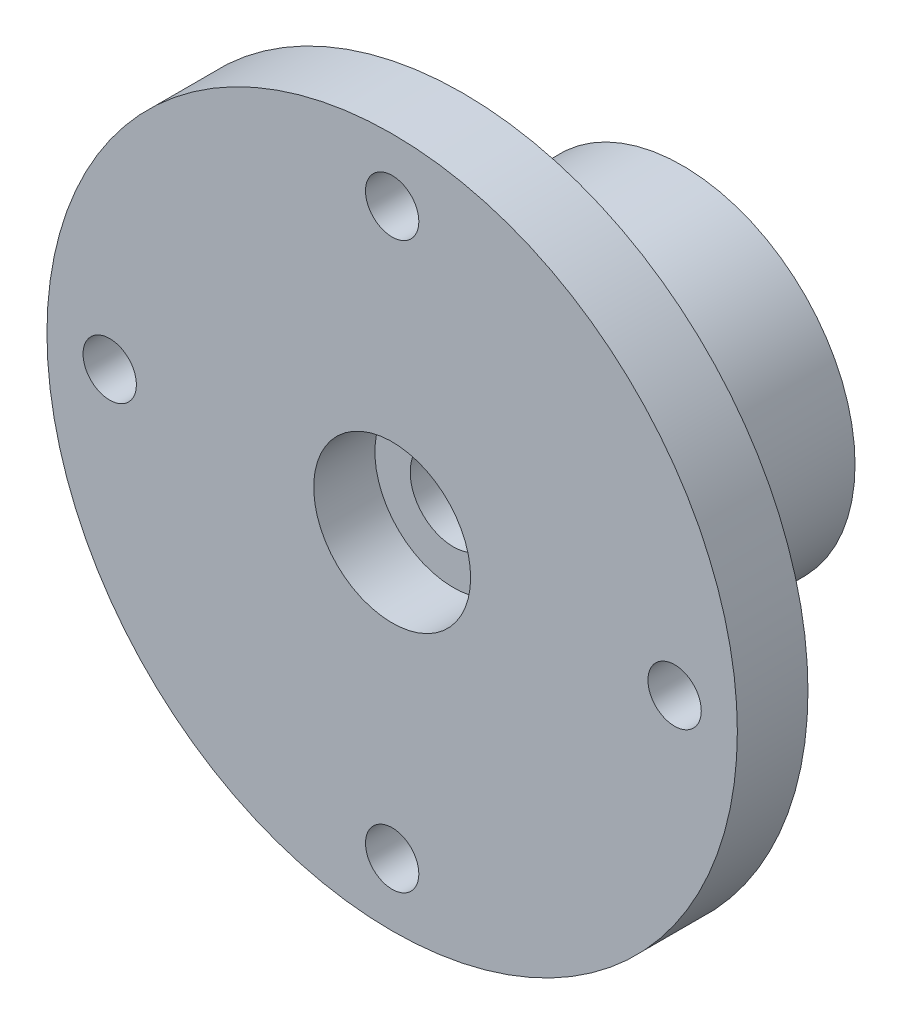
ISO-10303-21;
HEADER;
FILE_DESCRIPTION(('STEP AP214'),'2;1');
FILE_NAME('part.step','',(''),(''),'','','');
FILE_SCHEMA(('AUTOMOTIVE_DESIGN { 1 0 10303 214 1 1 1 1 }'));
ENDSEC;
DATA;
#1=APPLICATION_CONTEXT('core data for automotive mechanical design processes');
#2=APPLICATION_PROTOCOL_DEFINITION('international standard','automotive_design',2000,#1);
#3=PRODUCT_CONTEXT('',#1,'mechanical');
#4=PRODUCT('Part','Part','',(#3));
#5=PRODUCT_RELATED_PRODUCT_CATEGORY('part','',(#4));
#6=PRODUCT_DEFINITION_FORMATION('','',#4);
#7=PRODUCT_DEFINITION_CONTEXT('part definition',#1,'design');
#8=PRODUCT_DEFINITION('design','',#6,#7);
#9=PRODUCT_DEFINITION_SHAPE('','',#8);
#10=(LENGTH_UNIT() NAMED_UNIT(*) SI_UNIT(.MILLI.,.METRE.));
#11=(NAMED_UNIT(*) PLANE_ANGLE_UNIT() SI_UNIT($,.RADIAN.));
#12=(NAMED_UNIT(*) SI_UNIT($,.STERADIAN.) SOLID_ANGLE_UNIT());
#13=UNCERTAINTY_MEASURE_WITH_UNIT(LENGTH_MEASURE(1.E-05),#10,'distance_accuracy_value','');
#14=(GEOMETRIC_REPRESENTATION_CONTEXT(3) GLOBAL_UNCERTAINTY_ASSIGNED_CONTEXT((#13)) GLOBAL_UNIT_ASSIGNED_CONTEXT((#10,
#11,#12)) REPRESENTATION_CONTEXT('',''));
#15=CARTESIAN_POINT('',(0.,0.,0.));
#16=DIRECTION('',(0.,0.,1.));
#17=DIRECTION('',(1.,0.,0.));
#18=AXIS2_PLACEMENT_3D('',#15,#16,#17);
#19=CARTESIAN_POINT('',(0.,0.,14.));
#20=DIRECTION('',(0.,0.,-1.));
#21=DIRECTION('',(-1.,0.,0.));
#22=AXIS2_PLACEMENT_3D('',#19,#20,#21);
#23=CYLINDRICAL_SURFACE('',#22,11.);
#24=CARTESIAN_POINT('',(0.,0.,13.5));
#25=DIRECTION('',(0.,0.,1.));
#26=DIRECTION('',(1.,0.,0.));
#27=AXIS2_PLACEMENT_3D('',#24,#25,#26);
#28=CIRCLE('',#27,11.);
#29=CARTESIAN_POINT('',(11.,0.,13.5));
#30=VERTEX_POINT('',#29);
#31=EDGE_CURVE('E10',#30,#30,#28,.F.);
#32=ORIENTED_EDGE('',*,*,#31,.T.);
#33=EDGE_LOOP('',(#32));
#34=FACE_BOUND('',#33,.T.);
#35=CARTESIAN_POINT('',(0.,0.,0.));
#36=DIRECTION('',(0.,0.,1.));
#37=DIRECTION('',(1.,0.,0.));
#38=AXIS2_PLACEMENT_3D('',#35,#36,#37);
#39=CIRCLE('',#38,11.);
#40=CARTESIAN_POINT('',(11.,0.,0.));
#41=VERTEX_POINT('',#40);
#42=EDGE_CURVE('E56',#41,#41,#39,.T.);
#43=ORIENTED_EDGE('',*,*,#42,.T.);
#44=EDGE_LOOP('',(#43));
#45=FACE_BOUND('',#44,.T.);
#46=ADVANCED_FACE('F43',(#34,#45),#23,.T.);
#47=CARTESIAN_POINT('',(0.,0.,0.));
#48=DIRECTION('',(0.,0.,1.));
#49=DIRECTION('',(1.,0.,0.));
#50=AXIS2_PLACEMENT_3D('',#47,#48,#49);
#51=PLANE('',#50);
#52=CARTESIAN_POINT('',(0.,0.,0.));
#53=DIRECTION('',(0.,0.,1.));
#54=DIRECTION('',(1.,0.,0.));
#55=AXIS2_PLACEMENT_3D('',#52,#53,#54);
#56=CIRCLE('',#55,2.75);
#57=CARTESIAN_POINT('',(2.75,0.,0.));
#58=VERTEX_POINT('',#57);
#59=EDGE_CURVE('E103',#58,#58,#56,.T.);
#60=ORIENTED_EDGE('',*,*,#59,.T.);
#61=EDGE_LOOP('',(#60));
#62=FACE_BOUND('',#61,.T.);
#63=ORIENTED_EDGE('',*,*,#42,.F.);
#64=EDGE_LOOP('',(#63));
#65=FACE_BOUND('',#64,.T.);
#66=ADVANCED_FACE('F140',(#62,#65),#51,.F.);
#67=CARTESIAN_POINT('',(0.,0.,18.5));
#68=DIRECTION('',(0.,0.,-1.));
#69=DIRECTION('',(-1.,0.,0.));
#70=AXIS2_PLACEMENT_3D('',#67,#68,#69);
#71=CYLINDRICAL_SURFACE('',#70,22.);
#72=CARTESIAN_POINT('',(0.,0.,18.5));
#73=DIRECTION('',(0.,0.,1.));
#74=DIRECTION('',(1.,0.,0.));
#75=AXIS2_PLACEMENT_3D('',#72,#73,#74);
#76=CIRCLE('',#75,22.);
#77=CARTESIAN_POINT('',(22.,0.,18.5));
#78=VERTEX_POINT('',#77);
#79=EDGE_CURVE('E61',#78,#78,#76,.T.);
#80=ORIENTED_EDGE('',*,*,#79,.F.);
#81=EDGE_LOOP('',(#80));
#82=FACE_BOUND('',#81,.T.);
#83=CARTESIAN_POINT('',(0.,0.,14.));
#84=DIRECTION('',(0.,0.,1.));
#85=DIRECTION('',(1.,0.,0.));
#86=AXIS2_PLACEMENT_3D('',#83,#84,#85);
#87=CIRCLE('',#86,22.);
#88=CARTESIAN_POINT('',(22.,0.,14.));
#89=VERTEX_POINT('',#88);
#90=EDGE_CURVE('E80',#89,#89,#87,.T.);
#91=ORIENTED_EDGE('',*,*,#90,.T.);
#92=EDGE_LOOP('',(#91));
#93=FACE_BOUND('',#92,.T.);
#94=ADVANCED_FACE('F126',(#82,#93),#71,.T.);
#95=CARTESIAN_POINT('',(0.,0.,18.5));
#96=DIRECTION('',(0.,0.,1.));
#97=DIRECTION('',(1.,0.,0.));
#98=AXIS2_PLACEMENT_3D('',#95,#96,#97);
#99=PLANE('',#98);
#100=CARTESIAN_POINT('',(0.,0.,18.5));
#101=DIRECTION('',(0.,0.,1.));
#102=DIRECTION('',(1.,0.,0.));
#103=AXIS2_PLACEMENT_3D('',#100,#101,#102);
#104=CIRCLE('',#103,5.);
#105=CARTESIAN_POINT('',(5.,0.,18.5));
#106=VERTEX_POINT('',#105);
#107=EDGE_CURVE('E115',#106,#106,#104,.T.);
#108=ORIENTED_EDGE('',*,*,#107,.F.);
#109=EDGE_LOOP('',(#108));
#110=FACE_BOUND('',#109,.T.);
#111=CARTESIAN_POINT('',(0.,18.,18.5));
#112=DIRECTION('',(0.,0.,1.));
#113=DIRECTION('',(1.,0.,0.));
#114=AXIS2_PLACEMENT_3D('',#111,#112,#113);
#115=CIRCLE('',#114,1.7);
#116=CARTESIAN_POINT('',(1.7,18.,18.5));
#117=VERTEX_POINT('',#116);
#118=EDGE_CURVE('E69',#117,#117,#115,.T.);
#119=ORIENTED_EDGE('',*,*,#118,.F.);
#120=EDGE_LOOP('',(#119));
#121=FACE_BOUND('',#120,.T.);
#122=CARTESIAN_POINT('',(18.0000000000005,5.08284223389574E-13,18.5));
#123=DIRECTION('',(0.,0.,1.));
#124=DIRECTION('',(1.,0.,0.));
#125=AXIS2_PLACEMENT_3D('',#122,#123,#124);
#126=CIRCLE('',#125,1.7);
#127=CARTESIAN_POINT('',(19.7000000000005,5.08284223389574E-13,18.5));
#128=VERTEX_POINT('',#127);
#129=EDGE_CURVE('E68',#128,#128,#126,.T.);
#130=ORIENTED_EDGE('',*,*,#129,.F.);
#131=EDGE_LOOP('',(#130));
#132=FACE_BOUND('',#131,.T.);
#133=CARTESIAN_POINT('',(1.01656844677915E-12,-18.,18.5));
#134=DIRECTION('',(0.,0.,1.));
#135=DIRECTION('',(1.,0.,0.));
#136=AXIS2_PLACEMENT_3D('',#133,#134,#135);
#137=CIRCLE('',#136,1.7);
#138=CARTESIAN_POINT('',(1.70000000000101,-18.,18.5));
#139=VERTEX_POINT('',#138);
#140=EDGE_CURVE('E74',#139,#139,#137,.T.);
#141=ORIENTED_EDGE('',*,*,#140,.F.);
#142=EDGE_LOOP('',(#141));
#143=FACE_BOUND('',#142,.T.);
#144=CARTESIAN_POINT('',(-17.9999999999995,-5.06079859151109E-13,18.5));
#145=DIRECTION('',(0.,0.,1.));
#146=DIRECTION('',(1.,0.,0.));
#147=AXIS2_PLACEMENT_3D('',#144,#145,#146);
#148=CIRCLE('',#147,1.7);
#149=CARTESIAN_POINT('',(-16.2999999999995,-5.06079859151109E-13,18.5));
#150=VERTEX_POINT('',#149);
#151=EDGE_CURVE('E78',#150,#150,#148,.T.);
#152=ORIENTED_EDGE('',*,*,#151,.F.);
#153=EDGE_LOOP('',(#152));
#154=FACE_BOUND('',#153,.T.);
#155=ORIENTED_EDGE('',*,*,#79,.T.);
#156=EDGE_LOOP('',(#155));
#157=FACE_BOUND('',#156,.T.);
#158=ADVANCED_FACE('F122',(#110,#121,#132,#143,#154,#157),#99,.T.);
#159=CARTESIAN_POINT('',(0.,0.,14.));
#160=DIRECTION('',(0.,0.,1.));
#161=DIRECTION('',(1.,0.,0.));
#162=AXIS2_PLACEMENT_3D('',#159,#160,#161);
#163=PLANE('',#162);
#164=CARTESIAN_POINT('',(0.,0.,14.));
#165=DIRECTION('',(0.,0.,1.));
#166=DIRECTION('',(1.,0.,0.));
#167=AXIS2_PLACEMENT_3D('',#164,#165,#166);
#168=CIRCLE('',#167,11.5);
#169=CARTESIAN_POINT('',(11.5,0.,14.));
#170=VERTEX_POINT('',#169);
#171=EDGE_CURVE('E51',#170,#170,#168,.T.);
#172=ORIENTED_EDGE('',*,*,#171,.T.);
#173=EDGE_LOOP('',(#172));
#174=FACE_BOUND('',#173,.T.);
#175=CARTESIAN_POINT('',(0.,18.,14.));
#176=DIRECTION('',(0.,0.,1.));
#177=DIRECTION('',(1.,0.,0.));
#178=AXIS2_PLACEMENT_3D('',#175,#176,#177);
#179=CIRCLE('',#178,1.7);
#180=CARTESIAN_POINT('',(1.7,18.,14.));
#181=VERTEX_POINT('',#180);
#182=EDGE_CURVE('E64',#181,#181,#179,.T.);
#183=ORIENTED_EDGE('',*,*,#182,.T.);
#184=EDGE_LOOP('',(#183));
#185=FACE_BOUND('',#184,.T.);
#186=CARTESIAN_POINT('',(18.0000000000005,5.08284223389574E-13,14.));
#187=DIRECTION('',(0.,0.,1.));
#188=DIRECTION('',(1.,0.,0.));
#189=AXIS2_PLACEMENT_3D('',#186,#187,#188);
#190=CIRCLE('',#189,1.7);
#191=CARTESIAN_POINT('',(19.7000000000005,5.08284223389574E-13,14.));
#192=VERTEX_POINT('',#191);
#193=EDGE_CURVE('E70',#192,#192,#190,.T.);
#194=ORIENTED_EDGE('',*,*,#193,.T.);
#195=EDGE_LOOP('',(#194));
#196=FACE_BOUND('',#195,.T.);
#197=CARTESIAN_POINT('',(1.01656844677915E-12,-18.,14.));
#198=DIRECTION('',(0.,0.,1.));
#199=DIRECTION('',(1.,0.,0.));
#200=AXIS2_PLACEMENT_3D('',#197,#198,#199);
#201=CIRCLE('',#200,1.7);
#202=CARTESIAN_POINT('',(1.70000000000101,-18.,14.));
#203=VERTEX_POINT('',#202);
#204=EDGE_CURVE('E75',#203,#203,#201,.T.);
#205=ORIENTED_EDGE('',*,*,#204,.T.);
#206=EDGE_LOOP('',(#205));
#207=FACE_BOUND('',#206,.T.);
#208=CARTESIAN_POINT('',(-17.9999999999995,-5.06079859151109E-13,14.));
#209=DIRECTION('',(0.,0.,1.));
#210=DIRECTION('',(1.,0.,0.));
#211=AXIS2_PLACEMENT_3D('',#208,#209,#210);
#212=CIRCLE('',#211,1.7);
#213=CARTESIAN_POINT('',(-16.2999999999995,-5.06079859151109E-13,14.));
#214=VERTEX_POINT('',#213);
#215=EDGE_CURVE('E84',#214,#214,#212,.T.);
#216=ORIENTED_EDGE('',*,*,#215,.T.);
#217=EDGE_LOOP('',(#216));
#218=FACE_BOUND('',#217,.T.);
#219=ORIENTED_EDGE('',*,*,#90,.F.);
#220=EDGE_LOOP('',(#219));
#221=FACE_BOUND('',#220,.T.);
#222=ADVANCED_FACE('F125',(#174,#185,#196,#207,#218,#221),#163,.F.);
#223=CARTESIAN_POINT('',(-17.9999999999995,-5.06079859151109E-13,18.5));
#224=DIRECTION('',(0.,0.,1.));
#225=DIRECTION('',(1.,0.,0.));
#226=AXIS2_PLACEMENT_3D('',#223,#224,#225);
#227=CYLINDRICAL_SURFACE('',#226,1.7);
#228=ORIENTED_EDGE('',*,*,#151,.T.);
#229=EDGE_LOOP('',(#228));
#230=FACE_BOUND('',#229,.T.);
#231=ORIENTED_EDGE('',*,*,#215,.F.);
#232=EDGE_LOOP('',(#231));
#233=FACE_BOUND('',#232,.T.);
#234=ADVANCED_FACE('F145',(#230,#233),#227,.F.);
#235=CARTESIAN_POINT('',(1.01656844677915E-12,-18.,18.5));
#236=DIRECTION('',(0.,0.,1.));
#237=DIRECTION('',(1.,0.,0.));
#238=AXIS2_PLACEMENT_3D('',#235,#236,#237);
#239=CYLINDRICAL_SURFACE('',#238,1.7);
#240=ORIENTED_EDGE('',*,*,#140,.T.);
#241=EDGE_LOOP('',(#240));
#242=FACE_BOUND('',#241,.T.);
#243=ORIENTED_EDGE('',*,*,#204,.F.);
#244=EDGE_LOOP('',(#243));
#245=FACE_BOUND('',#244,.T.);
#246=ADVANCED_FACE('F152',(#242,#245),#239,.F.);
#247=CARTESIAN_POINT('',(18.0000000000005,5.08284223389574E-13,18.5));
#248=DIRECTION('',(0.,0.,1.));
#249=DIRECTION('',(1.,0.,0.));
#250=AXIS2_PLACEMENT_3D('',#247,#248,#249);
#251=CYLINDRICAL_SURFACE('',#250,1.7);
#252=ORIENTED_EDGE('',*,*,#129,.T.);
#253=EDGE_LOOP('',(#252));
#254=FACE_BOUND('',#253,.T.);
#255=ORIENTED_EDGE('',*,*,#193,.F.);
#256=EDGE_LOOP('',(#255));
#257=FACE_BOUND('',#256,.T.);
#258=ADVANCED_FACE('F189',(#254,#257),#251,.F.);
#259=CARTESIAN_POINT('',(0.,18.,18.5));
#260=DIRECTION('',(0.,0.,1.));
#261=DIRECTION('',(1.,0.,0.));
#262=AXIS2_PLACEMENT_3D('',#259,#260,#261);
#263=CYLINDRICAL_SURFACE('',#262,1.7);
#264=ORIENTED_EDGE('',*,*,#118,.T.);
#265=EDGE_LOOP('',(#264));
#266=FACE_BOUND('',#265,.T.);
#267=ORIENTED_EDGE('',*,*,#182,.F.);
#268=EDGE_LOOP('',(#267));
#269=FACE_BOUND('',#268,.T.);
#270=ADVANCED_FACE('F174',(#266,#269),#263,.F.);
#271=CARTESIAN_POINT('',(0.,0.,18.5));
#272=DIRECTION('',(0.,0.,1.));
#273=DIRECTION('',(1.,0.,0.));
#274=AXIS2_PLACEMENT_3D('',#271,#272,#273);
#275=CYLINDRICAL_SURFACE('',#274,2.75);
#276=ORIENTED_EDGE('',*,*,#59,.F.);
#277=EDGE_LOOP('',(#276));
#278=FACE_BOUND('',#277,.T.);
#279=CARTESIAN_POINT('',(0.,0.,14.6));
#280=DIRECTION('',(0.,0.,1.));
#281=DIRECTION('',(1.,0.,0.));
#282=AXIS2_PLACEMENT_3D('',#279,#280,#281);
#283=CIRCLE('',#282,2.75);
#284=CARTESIAN_POINT('',(2.75,0.,14.6));
#285=VERTEX_POINT('',#284);
#286=EDGE_CURVE('E107',#285,#285,#283,.T.);
#287=ORIENTED_EDGE('',*,*,#286,.T.);
#288=EDGE_LOOP('',(#287));
#289=FACE_BOUND('',#288,.T.);
#290=ADVANCED_FACE('F170',(#278,#289),#275,.F.);
#291=CARTESIAN_POINT('',(2.75,0.,14.6));
#292=DIRECTION('',(0.,0.,-1.));
#293=DIRECTION('',(-1.,0.,0.));
#294=AXIS2_PLACEMENT_3D('',#291,#292,#293);
#295=PLANE('',#294);
#296=ORIENTED_EDGE('',*,*,#286,.F.);
#297=EDGE_LOOP('',(#296));
#298=FACE_BOUND('',#297,.T.);
#299=CARTESIAN_POINT('',(0.,0.,14.6));
#300=DIRECTION('',(0.,0.,1.));
#301=DIRECTION('',(1.,0.,0.));
#302=AXIS2_PLACEMENT_3D('',#299,#300,#301);
#303=CIRCLE('',#302,5.);
#304=CARTESIAN_POINT('',(5.,0.,14.6));
#305=VERTEX_POINT('',#304);
#306=EDGE_CURVE('E111',#305,#305,#303,.T.);
#307=ORIENTED_EDGE('',*,*,#306,.T.);
#308=EDGE_LOOP('',(#307));
#309=FACE_BOUND('',#308,.T.);
#310=ADVANCED_FACE('F173',(#298,#309),#295,.F.);
#311=CARTESIAN_POINT('',(0.,0.,18.5));
#312=DIRECTION('',(0.,0.,1.));
#313=DIRECTION('',(1.,0.,0.));
#314=AXIS2_PLACEMENT_3D('',#311,#312,#313);
#315=CYLINDRICAL_SURFACE('',#314,5.);
#316=ORIENTED_EDGE('',*,*,#306,.F.);
#317=EDGE_LOOP('',(#316));
#318=FACE_BOUND('',#317,.T.);
#319=ORIENTED_EDGE('',*,*,#107,.T.);
#320=EDGE_LOOP('',(#319));
#321=FACE_BOUND('',#320,.T.);
#322=ADVANCED_FACE('F120',(#318,#321),#315,.F.);
#323=CARTESIAN_POINT('',(0.,0.,13.5));
#324=DIRECTION('',(0.,0.,1.));
#325=DIRECTION('',(1.,0.,0.));
#326=AXIS2_PLACEMENT_3D('',#323,#324,#325);
#327=TOROIDAL_SURFACE('',#326,11.5,0.5);
#328=ORIENTED_EDGE('',*,*,#31,.F.);
#329=EDGE_LOOP('',(#328));
#330=FACE_BOUND('',#329,.T.);
#331=ORIENTED_EDGE('',*,*,#171,.F.);
#332=EDGE_LOOP('',(#331));
#333=FACE_BOUND('',#332,.T.);
#334=ADVANCED_FACE('F45',(#330,#333),#327,.F.);
#335=CLOSED_SHELL('',(#46,#66,#94,#158,#222,#234,#246,#258,#270,#290,#310,#322,#334));
#336=MANIFOLD_SOLID_BREP('B2',#335);
#337=ADVANCED_BREP_SHAPE_REPRESENTATION('',(#18,#336),#14);
#338=SHAPE_DEFINITION_REPRESENTATION(#9,#337);
ENDSEC;
END-ISO-10303-21;
